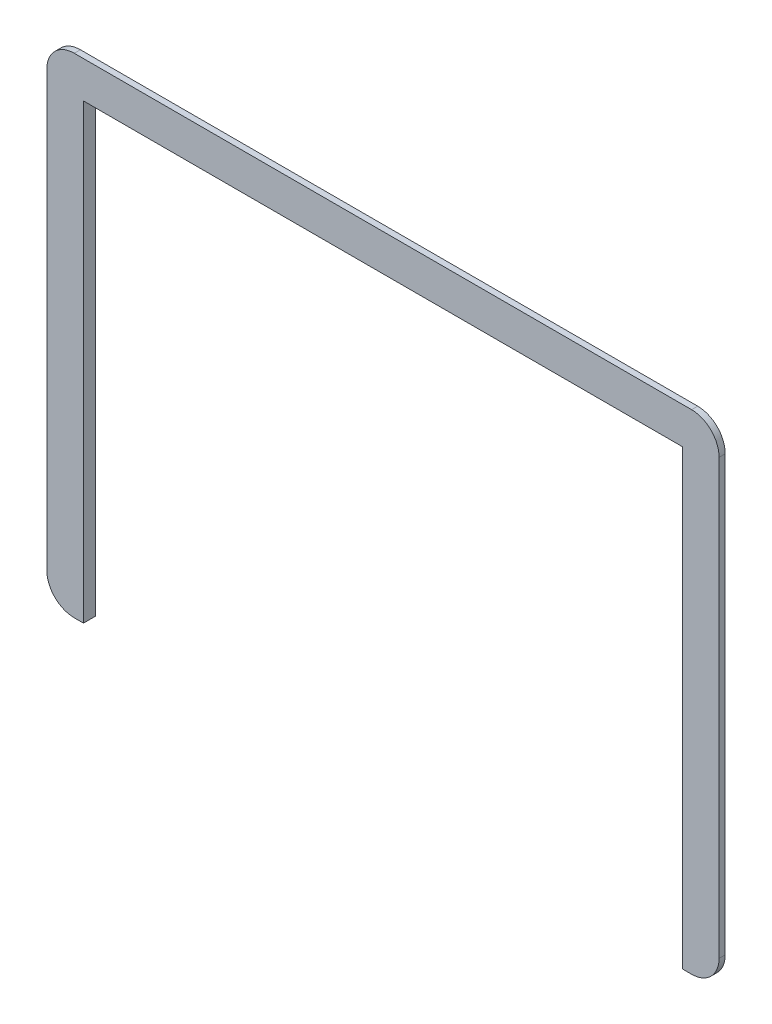
ISO-10303-21;
HEADER;
FILE_DESCRIPTION(('STEP AP214'),'2;1');
FILE_NAME('part.step','',(''),(''),'','','');
FILE_SCHEMA(('AUTOMOTIVE_DESIGN { 1 0 10303 214 1 1 1 1 }'));
ENDSEC;
DATA;
#1=APPLICATION_CONTEXT('core data for automotive mechanical design processes');
#2=APPLICATION_PROTOCOL_DEFINITION('international standard','automotive_design',2000,#1);
#3=PRODUCT_CONTEXT('',#1,'mechanical');
#4=PRODUCT('Part','Part','',(#3));
#5=PRODUCT_RELATED_PRODUCT_CATEGORY('part','',(#4));
#6=PRODUCT_DEFINITION_FORMATION('','',#4);
#7=PRODUCT_DEFINITION_CONTEXT('part definition',#1,'design');
#8=PRODUCT_DEFINITION('design','',#6,#7);
#9=PRODUCT_DEFINITION_SHAPE('','',#8);
#10=(LENGTH_UNIT() NAMED_UNIT(*) SI_UNIT(.MILLI.,.METRE.));
#11=(NAMED_UNIT(*) PLANE_ANGLE_UNIT() SI_UNIT($,.RADIAN.));
#12=(NAMED_UNIT(*) SI_UNIT($,.STERADIAN.) SOLID_ANGLE_UNIT());
#13=UNCERTAINTY_MEASURE_WITH_UNIT(LENGTH_MEASURE(1.E-05),#10,'distance_accuracy_value','');
#14=(GEOMETRIC_REPRESENTATION_CONTEXT(3) GLOBAL_UNCERTAINTY_ASSIGNED_CONTEXT((#13)) GLOBAL_UNIT_ASSIGNED_CONTEXT((#10,
#11,#12)) REPRESENTATION_CONTEXT('',''));
#15=CARTESIAN_POINT('',(0.,0.,0.));
#16=DIRECTION('',(0.,0.,1.));
#17=DIRECTION('',(1.,0.,0.));
#18=AXIS2_PLACEMENT_3D('',#15,#16,#17);
#19=CARTESIAN_POINT('',(-40.7055055401663,140.131578947368,2.));
#20=DIRECTION('',(1.,0.,0.));
#21=DIRECTION('',(0.,1.,0.));
#22=AXIS2_PLACEMENT_3D('',#19,#20,#21);
#23=PLANE('',#22);
#24=DIRECTION('',(0.,-1.,0.));
#25=VECTOR('',#24,1.);
#26=CARTESIAN_POINT('',(-40.7055055401663,140.131578947368,2.));
#27=LINE('',#26,#25);
#28=CARTESIAN_POINT('',(-40.7055055401663,131.131578947368,2.));
#29=VERTEX_POINT('',#28);
#30=CARTESIAN_POINT('',(-40.7055055401663,-10.8684210526316,2.));
#31=VERTEX_POINT('',#30);
#32=EDGE_CURVE('E217',#29,#31,#27,.T.);
#33=ORIENTED_EDGE('',*,*,#32,.F.);
#34=DIRECTION('',(0.,0.,-1.));
#35=VECTOR('',#34,1.);
#36=CARTESIAN_POINT('',(-40.7055055401663,131.131578947368,2.));
#37=LINE('',#36,#35);
#38=CARTESIAN_POINT('',(-40.7055055401663,131.131578947368,0.));
#39=VERTEX_POINT('',#38);
#40=EDGE_CURVE('E40',#29,#39,#37,.T.);
#41=ORIENTED_EDGE('',*,*,#40,.T.);
#42=DIRECTION('',(0.,-1.,0.));
#43=VECTOR('',#42,1.);
#44=CARTESIAN_POINT('',(-40.7055055401663,140.131578947368,0.));
#45=LINE('',#44,#43);
#46=CARTESIAN_POINT('',(-40.7055055401663,-10.8684210526316,0.));
#47=VERTEX_POINT('',#46);
#48=EDGE_CURVE('E202',#39,#47,#45,.T.);
#49=ORIENTED_EDGE('',*,*,#48,.T.);
#50=DIRECTION('',(0.,0.,-1.));
#51=VECTOR('',#50,1.);
#52=CARTESIAN_POINT('',(-40.7055055401663,-10.8684210526316,2.));
#53=LINE('',#52,#51);
#54=EDGE_CURVE('E274',#47,#31,#53,.F.);
#55=ORIENTED_EDGE('',*,*,#54,.T.);
#56=EDGE_LOOP('',(#33,#41,#49,#55));
#57=FACE_BOUND('',#56,.T.);
#58=ADVANCED_FACE('F32',(#57),#23,.F.);
#59=CARTESIAN_POINT('',(-40.7055055401663,-19.8684210526316,2.));
#60=DIRECTION('',(0.,1.,0.));
#61=DIRECTION('',(0.,0.,1.));
#62=AXIS2_PLACEMENT_3D('',#59,#60,#61);
#63=PLANE('',#62);
#64=DIRECTION('',(1.,0.,0.));
#65=VECTOR('',#64,1.);
#66=CARTESIAN_POINT('',(-40.7055055401663,-19.8684210526316,2.));
#67=LINE('',#66,#65);
#68=CARTESIAN_POINT('',(-31.7055055401662,-19.8684210526316,2.));
#69=VERTEX_POINT('',#68);
#70=CARTESIAN_POINT('',(-28.7055055401662,-19.8684210526316,2.));
#71=VERTEX_POINT('',#70);
#72=EDGE_CURVE('E220',#69,#71,#67,.T.);
#73=ORIENTED_EDGE('',*,*,#72,.F.);
#74=DIRECTION('',(0.,0.,-1.));
#75=VECTOR('',#74,1.);
#76=CARTESIAN_POINT('',(-31.7055055401662,-19.8684210526316,2.));
#77=LINE('',#76,#75);
#78=CARTESIAN_POINT('',(-31.7055055401662,-19.8684210526316,0.));
#79=VERTEX_POINT('',#78);
#80=EDGE_CURVE('E11',#69,#79,#77,.T.);
#81=ORIENTED_EDGE('',*,*,#80,.T.);
#82=DIRECTION('',(1.,0.,0.));
#83=VECTOR('',#82,1.);
#84=CARTESIAN_POINT('',(-40.7055055401663,-19.8684210526316,0.));
#85=LINE('',#84,#83);
#86=CARTESIAN_POINT('',(-30.7055055401662,-19.8684210526316,0.));
#87=VERTEX_POINT('',#86);
#88=EDGE_CURVE('E154',#79,#87,#85,.T.);
#89=ORIENTED_EDGE('',*,*,#88,.T.);
#90=DIRECTION('',(0.,0.,1.));
#91=VECTOR('',#90,1.);
#92=CARTESIAN_POINT('',(-30.7055055401662,-19.8684210526316,-2.));
#93=LINE('',#92,#91);
#94=CARTESIAN_POINT('',(-30.7055055401662,-19.8684210526316,-2.));
#95=VERTEX_POINT('',#94);
#96=EDGE_CURVE('E147',#95,#87,#93,.T.);
#97=ORIENTED_EDGE('',*,*,#96,.F.);
#98=DIRECTION('',(1.,0.,0.));
#99=VECTOR('',#98,1.);
#100=CARTESIAN_POINT('',(-30.7055055401662,-19.8684210526316,-2.));
#101=LINE('',#100,#99);
#102=CARTESIAN_POINT('',(-28.7055055401662,-19.8684210526316,-2.));
#103=VERTEX_POINT('',#102);
#104=EDGE_CURVE('E152',#95,#103,#101,.T.);
#105=ORIENTED_EDGE('',*,*,#104,.T.);
#106=DIRECTION('',(0.,0.,1.));
#107=VECTOR('',#106,1.);
#108=CARTESIAN_POINT('',(-28.7055055401662,-19.8684210526316,-2.));
#109=LINE('',#108,#107);
#110=EDGE_CURVE('E159',#103,#71,#109,.T.);
#111=ORIENTED_EDGE('',*,*,#110,.T.);
#112=EDGE_LOOP('',(#73,#81,#89,#97,#105,#111));
#113=FACE_BOUND('',#112,.T.);
#114=ADVANCED_FACE('F150',(#113),#63,.F.);
#115=CARTESIAN_POINT('',(169.294494459834,-19.8684210526316,2.));
#116=DIRECTION('',(0.,1.,0.));
#117=DIRECTION('',(0.,0.,1.));
#118=AXIS2_PLACEMENT_3D('',#115,#116,#117);
#119=PLANE('',#118);
#120=DIRECTION('',(1.,0.,0.));
#121=VECTOR('',#120,1.);
#122=CARTESIAN_POINT('',(169.294494459834,-19.8684210526316,0.));
#123=LINE('',#122,#121);
#124=CARTESIAN_POINT('',(169.294494459834,-19.8684210526316,0.));
#125=VERTEX_POINT('',#124);
#126=CARTESIAN_POINT('',(170.294494459834,-19.8684210526316,0.));
#127=VERTEX_POINT('',#126);
#128=EDGE_CURVE('E242',#125,#127,#123,.T.);
#129=ORIENTED_EDGE('',*,*,#128,.T.);
#130=DIRECTION('',(0.,0.,-1.));
#131=VECTOR('',#130,1.);
#132=CARTESIAN_POINT('',(170.294494459834,-19.8684210526316,2.));
#133=LINE('',#132,#131);
#134=CARTESIAN_POINT('',(170.294494459834,-19.8684210526316,2.));
#135=VERTEX_POINT('',#134);
#136=EDGE_CURVE('E261',#127,#135,#133,.F.);
#137=ORIENTED_EDGE('',*,*,#136,.T.);
#138=DIRECTION('',(1.,0.,0.));
#139=VECTOR('',#138,1.);
#140=CARTESIAN_POINT('',(169.294494459834,-19.8684210526316,2.));
#141=LINE('',#140,#139);
#142=CARTESIAN_POINT('',(167.294494459834,-19.8684210526316,2.));
#143=VERTEX_POINT('',#142);
#144=EDGE_CURVE('E223',#143,#135,#141,.T.);
#145=ORIENTED_EDGE('',*,*,#144,.F.);
#146=DIRECTION('',(0.,0.,1.));
#147=VECTOR('',#146,1.);
#148=CARTESIAN_POINT('',(167.294494459834,-19.8684210526316,-2.));
#149=LINE('',#148,#147);
#150=CARTESIAN_POINT('',(167.294494459834,-19.8684210526316,-2.));
#151=VERTEX_POINT('',#150);
#152=EDGE_CURVE('E209',#151,#143,#149,.T.);
#153=ORIENTED_EDGE('',*,*,#152,.F.);
#154=DIRECTION('',(1.,0.,0.));
#155=VECTOR('',#154,1.);
#156=CARTESIAN_POINT('',(167.294494459834,-19.8684210526316,-2.));
#157=LINE('',#156,#155);
#158=CARTESIAN_POINT('',(169.294494459834,-19.8684210526316,-2.));
#159=VERTEX_POINT('',#158);
#160=EDGE_CURVE('E189',#151,#159,#157,.T.);
#161=ORIENTED_EDGE('',*,*,#160,.T.);
#162=DIRECTION('',(0.,0.,1.));
#163=VECTOR('',#162,1.);
#164=CARTESIAN_POINT('',(169.294494459834,-19.8684210526316,-2.));
#165=LINE('',#164,#163);
#166=EDGE_CURVE('E206',#159,#125,#165,.T.);
#167=ORIENTED_EDGE('',*,*,#166,.T.);
#168=EDGE_LOOP('',(#129,#137,#145,#153,#161,#167));
#169=FACE_BOUND('',#168,.T.);
#170=ADVANCED_FACE('F307',(#169),#119,.F.);
#171=CARTESIAN_POINT('',(179.294494459834,-19.8684210526316,2.));
#172=DIRECTION('',(-1.,0.,0.));
#173=DIRECTION('',(0.,0.,1.));
#174=AXIS2_PLACEMENT_3D('',#171,#172,#173);
#175=PLANE('',#174);
#176=DIRECTION('',(0.,1.,0.));
#177=VECTOR('',#176,1.);
#178=CARTESIAN_POINT('',(179.294494459834,-19.8684210526316,2.));
#179=LINE('',#178,#177);
#180=CARTESIAN_POINT('',(179.294494459834,-10.8684210526316,2.));
#181=VERTEX_POINT('',#180);
#182=CARTESIAN_POINT('',(179.294494459834,131.131578947368,2.));
#183=VERTEX_POINT('',#182);
#184=EDGE_CURVE('E226',#181,#183,#179,.T.);
#185=ORIENTED_EDGE('',*,*,#184,.F.);
#186=DIRECTION('',(0.,0.,-1.));
#187=VECTOR('',#186,1.);
#188=CARTESIAN_POINT('',(179.294494459834,-10.8684210526316,2.));
#189=LINE('',#188,#187);
#190=CARTESIAN_POINT('',(179.294494459834,-10.8684210526316,0.));
#191=VERTEX_POINT('',#190);
#192=EDGE_CURVE('E250',#181,#191,#189,.T.);
#193=ORIENTED_EDGE('',*,*,#192,.T.);
#194=DIRECTION('',(0.,1.,0.));
#195=VECTOR('',#194,1.);
#196=CARTESIAN_POINT('',(179.294494459834,-19.8684210526316,0.));
#197=LINE('',#196,#195);
#198=CARTESIAN_POINT('',(179.294494459834,131.131578947368,0.));
#199=VERTEX_POINT('',#198);
#200=EDGE_CURVE('E245',#191,#199,#197,.T.);
#201=ORIENTED_EDGE('',*,*,#200,.T.);
#202=DIRECTION('',(0.,0.,-1.));
#203=VECTOR('',#202,1.);
#204=CARTESIAN_POINT('',(179.294494459834,131.131578947368,2.));
#205=LINE('',#204,#203);
#206=EDGE_CURVE('E230',#199,#183,#205,.F.);
#207=ORIENTED_EDGE('',*,*,#206,.T.);
#208=EDGE_LOOP('',(#185,#193,#201,#207));
#209=FACE_BOUND('',#208,.T.);
#210=ADVANCED_FACE('F323',(#209),#175,.F.);
#211=CARTESIAN_POINT('',(179.294494459834,140.131578947368,2.));
#212=DIRECTION('',(0.,-1.,0.));
#213=DIRECTION('',(1.,0.,0.));
#214=AXIS2_PLACEMENT_3D('',#211,#212,#213);
#215=PLANE('',#214);
#216=DIRECTION('',(-1.,0.,0.));
#217=VECTOR('',#216,1.);
#218=CARTESIAN_POINT('',(179.294494459834,140.131578947368,2.));
#219=LINE('',#218,#217);
#220=CARTESIAN_POINT('',(170.294494459834,140.131578947368,2.));
#221=VERTEX_POINT('',#220);
#222=CARTESIAN_POINT('',(-31.7055055401663,140.131578947368,2.));
#223=VERTEX_POINT('',#222);
#224=EDGE_CURVE('E228',#221,#223,#219,.T.);
#225=ORIENTED_EDGE('',*,*,#224,.F.);
#226=DIRECTION('',(0.,0.,-1.));
#227=VECTOR('',#226,1.);
#228=CARTESIAN_POINT('',(170.294494459834,140.131578947368,2.));
#229=LINE('',#228,#227);
#230=CARTESIAN_POINT('',(170.294494459834,140.131578947368,0.));
#231=VERTEX_POINT('',#230);
#232=EDGE_CURVE('E271',#221,#231,#229,.T.);
#233=ORIENTED_EDGE('',*,*,#232,.T.);
#234=DIRECTION('',(-1.,0.,0.));
#235=VECTOR('',#234,1.);
#236=CARTESIAN_POINT('',(179.294494459834,140.131578947368,0.));
#237=LINE('',#236,#235);
#238=CARTESIAN_POINT('',(-31.7055055401663,140.131578947368,0.));
#239=VERTEX_POINT('',#238);
#240=EDGE_CURVE('E221',#231,#239,#237,.T.);
#241=ORIENTED_EDGE('',*,*,#240,.T.);
#242=DIRECTION('',(0.,0.,-1.));
#243=VECTOR('',#242,1.);
#244=CARTESIAN_POINT('',(-31.7055055401663,140.131578947368,2.));
#245=LINE('',#244,#243);
#246=EDGE_CURVE('E47',#239,#223,#245,.F.);
#247=ORIENTED_EDGE('',*,*,#246,.T.);
#248=EDGE_LOOP('',(#225,#233,#241,#247));
#249=FACE_BOUND('',#248,.T.);
#250=ADVANCED_FACE('F326',(#249),#215,.F.);
#251=CARTESIAN_POINT('',(0.,0.,2.));
#252=DIRECTION('',(0.,0.,1.));
#253=DIRECTION('',(1.,0.,0.));
#254=AXIS2_PLACEMENT_3D('',#251,#252,#253);
#255=PLANE('',#254);
#256=ORIENTED_EDGE('',*,*,#144,.T.);
#257=CARTESIAN_POINT('',(170.294494459834,-10.8684210526316,2.));
#258=DIRECTION('',(0.,0.,1.));
#259=DIRECTION('',(1.,0.,0.));
#260=AXIS2_PLACEMENT_3D('',#257,#258,#259);
#261=CIRCLE('',#260,9.);
#262=EDGE_CURVE('E268',#135,#181,#261,.T.);
#263=ORIENTED_EDGE('',*,*,#262,.T.);
#264=ORIENTED_EDGE('',*,*,#184,.T.);
#265=CARTESIAN_POINT('',(170.294494459834,131.131578947368,2.));
#266=DIRECTION('',(0.,0.,1.));
#267=DIRECTION('',(1.,0.,0.));
#268=AXIS2_PLACEMENT_3D('',#265,#266,#267);
#269=CIRCLE('',#268,9.);
#270=EDGE_CURVE('E54',#183,#221,#269,.T.);
#271=ORIENTED_EDGE('',*,*,#270,.T.);
#272=ORIENTED_EDGE('',*,*,#224,.T.);
#273=CARTESIAN_POINT('',(-31.7055055401663,131.131578947368,2.));
#274=DIRECTION('',(0.,0.,1.));
#275=DIRECTION('',(1.,0.,0.));
#276=AXIS2_PLACEMENT_3D('',#273,#274,#275);
#277=CIRCLE('',#276,9.);
#278=EDGE_CURVE('E265',#223,#29,#277,.T.);
#279=ORIENTED_EDGE('',*,*,#278,.T.);
#280=ORIENTED_EDGE('',*,*,#32,.T.);
#281=CARTESIAN_POINT('',(-31.7055055401662,-10.8684210526316,2.));
#282=DIRECTION('',(0.,0.,1.));
#283=DIRECTION('',(1.,0.,0.));
#284=AXIS2_PLACEMENT_3D('',#281,#282,#283);
#285=CIRCLE('',#284,9.);
#286=EDGE_CURVE('E263',#31,#69,#285,.T.);
#287=ORIENTED_EDGE('',*,*,#286,.T.);
#288=ORIENTED_EDGE('',*,*,#72,.T.);
#289=DIRECTION('',(0.,1.,0.));
#290=VECTOR('',#289,1.);
#291=CARTESIAN_POINT('',(-28.7055055401662,-19.8684210526316,2.));
#292=LINE('',#291,#290);
#293=CARTESIAN_POINT('',(-28.7055055401662,128.131578947368,2.));
#294=VERTEX_POINT('',#293);
#295=EDGE_CURVE('E196',#71,#294,#292,.T.);
#296=ORIENTED_EDGE('',*,*,#295,.T.);
#297=DIRECTION('',(1.,0.,0.));
#298=VECTOR('',#297,1.);
#299=CARTESIAN_POINT('',(-28.7055055401662,128.131578947368,2.));
#300=LINE('',#299,#298);
#301=CARTESIAN_POINT('',(167.294494459834,128.131578947368,2.));
#302=VERTEX_POINT('',#301);
#303=EDGE_CURVE('E179',#294,#302,#300,.T.);
#304=ORIENTED_EDGE('',*,*,#303,.T.);
#305=DIRECTION('',(0.,-1.,0.));
#306=VECTOR('',#305,1.);
#307=CARTESIAN_POINT('',(167.294494459834,128.131578947368,2.));
#308=LINE('',#307,#306);
#309=EDGE_CURVE('E176',#302,#143,#308,.T.);
#310=ORIENTED_EDGE('',*,*,#309,.T.);
#311=EDGE_LOOP('',(#256,#263,#264,#271,#272,#279,#280,#287,#288,#296,#304,#310));
#312=FACE_BOUND('',#311,.T.);
#313=ADVANCED_FACE('F291',(#312),#255,.T.);
#314=CARTESIAN_POINT('',(0.,0.,0.));
#315=DIRECTION('',(0.,0.,1.));
#316=DIRECTION('',(1.,0.,0.));
#317=AXIS2_PLACEMENT_3D('',#314,#315,#316);
#318=PLANE('',#317);
#319=ORIENTED_EDGE('',*,*,#200,.F.);
#320=CARTESIAN_POINT('',(170.294494459834,-10.8684210526316,0.));
#321=DIRECTION('',(0.,0.,1.));
#322=DIRECTION('',(1.,0.,0.));
#323=AXIS2_PLACEMENT_3D('',#320,#321,#322);
#324=CIRCLE('',#323,9.);
#325=EDGE_CURVE('E259',#191,#127,#324,.F.);
#326=ORIENTED_EDGE('',*,*,#325,.T.);
#327=ORIENTED_EDGE('',*,*,#128,.F.);
#328=DIRECTION('',(0.,-1.,0.));
#329=VECTOR('',#328,1.);
#330=CARTESIAN_POINT('',(169.294494459834,130.131578947368,0.));
#331=LINE('',#330,#329);
#332=CARTESIAN_POINT('',(169.294494459834,130.131578947368,0.));
#333=VERTEX_POINT('',#332);
#334=EDGE_CURVE('E239',#333,#125,#331,.T.);
#335=ORIENTED_EDGE('',*,*,#334,.F.);
#336=DIRECTION('',(1.,0.,0.));
#337=VECTOR('',#336,1.);
#338=CARTESIAN_POINT('',(-30.7055055401662,130.131578947368,0.));
#339=LINE('',#338,#337);
#340=CARTESIAN_POINT('',(-30.7055055401662,130.131578947368,0.));
#341=VERTEX_POINT('',#340);
#342=EDGE_CURVE('E236',#341,#333,#339,.T.);
#343=ORIENTED_EDGE('',*,*,#342,.F.);
#344=DIRECTION('',(0.,1.,0.));
#345=VECTOR('',#344,1.);
#346=CARTESIAN_POINT('',(-30.7055055401662,-19.8684210526316,0.));
#347=LINE('',#346,#345);
#348=EDGE_CURVE('E234',#87,#341,#347,.T.);
#349=ORIENTED_EDGE('',*,*,#348,.F.);
#350=ORIENTED_EDGE('',*,*,#88,.F.);
#351=CARTESIAN_POINT('',(-31.7055055401662,-10.8684210526316,0.));
#352=DIRECTION('',(0.,0.,1.));
#353=DIRECTION('',(1.,0.,0.));
#354=AXIS2_PLACEMENT_3D('',#351,#352,#353);
#355=CIRCLE('',#354,9.);
#356=EDGE_CURVE('E253',#79,#47,#355,.F.);
#357=ORIENTED_EDGE('',*,*,#356,.T.);
#358=ORIENTED_EDGE('',*,*,#48,.F.);
#359=CARTESIAN_POINT('',(-31.7055055401663,131.131578947368,0.));
#360=DIRECTION('',(0.,0.,1.));
#361=DIRECTION('',(1.,0.,0.));
#362=AXIS2_PLACEMENT_3D('',#359,#360,#361);
#363=CIRCLE('',#362,9.);
#364=EDGE_CURVE('E255',#39,#239,#363,.F.);
#365=ORIENTED_EDGE('',*,*,#364,.T.);
#366=ORIENTED_EDGE('',*,*,#240,.F.);
#367=CARTESIAN_POINT('',(170.294494459834,131.131578947368,0.));
#368=DIRECTION('',(0.,0.,1.));
#369=DIRECTION('',(1.,0.,0.));
#370=AXIS2_PLACEMENT_3D('',#367,#368,#369);
#371=CIRCLE('',#370,9.);
#372=EDGE_CURVE('E257',#231,#199,#371,.F.);
#373=ORIENTED_EDGE('',*,*,#372,.T.);
#374=EDGE_LOOP('',(#319,#326,#327,#335,#343,#349,#350,#357,#358,#365,#366,#373));
#375=FACE_BOUND('',#374,.T.);
#376=ADVANCED_FACE('F285',(#375),#318,.F.);
#377=CARTESIAN_POINT('',(-30.7055055401662,130.131578947368,-2.));
#378=DIRECTION('',(-1.,0.,0.));
#379=DIRECTION('',(0.,0.,1.));
#380=AXIS2_PLACEMENT_3D('',#377,#378,#379);
#381=PLANE('',#380);
#382=ORIENTED_EDGE('',*,*,#348,.T.);
#383=DIRECTION('',(0.,0.,1.));
#384=VECTOR('',#383,1.);
#385=CARTESIAN_POINT('',(-30.7055055401662,130.131578947368,-2.));
#386=LINE('',#385,#384);
#387=CARTESIAN_POINT('',(-30.7055055401662,130.131578947368,-2.));
#388=VERTEX_POINT('',#387);
#389=EDGE_CURVE('E175',#388,#341,#386,.T.);
#390=ORIENTED_EDGE('',*,*,#389,.F.);
#391=DIRECTION('',(0.,-1.,0.));
#392=VECTOR('',#391,1.);
#393=CARTESIAN_POINT('',(-30.7055055401662,130.131578947368,-2.));
#394=LINE('',#393,#392);
#395=EDGE_CURVE('E167',#388,#95,#394,.T.);
#396=ORIENTED_EDGE('',*,*,#395,.T.);
#397=ORIENTED_EDGE('',*,*,#96,.T.);
#398=EDGE_LOOP('',(#382,#390,#396,#397));
#399=FACE_BOUND('',#398,.T.);
#400=ADVANCED_FACE('F173',(#399),#381,.T.);
#401=CARTESIAN_POINT('',(169.294494459834,130.131578947368,-2.));
#402=DIRECTION('',(0.,1.,0.));
#403=DIRECTION('',(0.,0.,1.));
#404=AXIS2_PLACEMENT_3D('',#401,#402,#403);
#405=PLANE('',#404);
#406=ORIENTED_EDGE('',*,*,#342,.T.);
#407=DIRECTION('',(0.,0.,1.));
#408=VECTOR('',#407,1.);
#409=CARTESIAN_POINT('',(169.294494459834,130.131578947368,-2.));
#410=LINE('',#409,#408);
#411=CARTESIAN_POINT('',(169.294494459834,130.131578947368,-2.));
#412=VERTEX_POINT('',#411);
#413=EDGE_CURVE('E203',#412,#333,#410,.T.);
#414=ORIENTED_EDGE('',*,*,#413,.F.);
#415=DIRECTION('',(-1.,0.,0.));
#416=VECTOR('',#415,1.);
#417=CARTESIAN_POINT('',(169.294494459834,130.131578947368,-2.));
#418=LINE('',#417,#416);
#419=EDGE_CURVE('E160',#412,#388,#418,.T.);
#420=ORIENTED_EDGE('',*,*,#419,.T.);
#421=ORIENTED_EDGE('',*,*,#389,.T.);
#422=EDGE_LOOP('',(#406,#414,#420,#421));
#423=FACE_BOUND('',#422,.T.);
#424=ADVANCED_FACE('F334',(#423),#405,.T.);
#425=CARTESIAN_POINT('',(169.294494459834,-19.8684210526316,-2.));
#426=DIRECTION('',(1.,0.,0.));
#427=DIRECTION('',(0.,0.,-1.));
#428=AXIS2_PLACEMENT_3D('',#425,#426,#427);
#429=PLANE('',#428);
#430=ORIENTED_EDGE('',*,*,#334,.T.);
#431=ORIENTED_EDGE('',*,*,#166,.F.);
#432=DIRECTION('',(0.,1.,0.));
#433=VECTOR('',#432,1.);
#434=CARTESIAN_POINT('',(169.294494459834,-19.8684210526316,-2.));
#435=LINE('',#434,#433);
#436=EDGE_CURVE('E192',#159,#412,#435,.T.);
#437=ORIENTED_EDGE('',*,*,#436,.T.);
#438=ORIENTED_EDGE('',*,*,#413,.T.);
#439=EDGE_LOOP('',(#430,#431,#437,#438));
#440=FACE_BOUND('',#439,.T.);
#441=ADVANCED_FACE('F331',(#440),#429,.T.);
#442=CARTESIAN_POINT('',(167.294494459834,128.131578947368,-2.));
#443=DIRECTION('',(-1.,0.,0.));
#444=DIRECTION('',(0.,-1.,0.));
#445=AXIS2_PLACEMENT_3D('',#442,#443,#444);
#446=PLANE('',#445);
#447=ORIENTED_EDGE('',*,*,#309,.F.);
#448=DIRECTION('',(0.,0.,1.));
#449=VECTOR('',#448,1.);
#450=CARTESIAN_POINT('',(167.294494459834,128.131578947368,-2.));
#451=LINE('',#450,#449);
#452=CARTESIAN_POINT('',(167.294494459834,128.131578947368,-2.));
#453=VERTEX_POINT('',#452);
#454=EDGE_CURVE('E212',#453,#302,#451,.T.);
#455=ORIENTED_EDGE('',*,*,#454,.F.);
#456=DIRECTION('',(0.,-1.,0.));
#457=VECTOR('',#456,1.);
#458=CARTESIAN_POINT('',(167.294494459834,128.131578947368,-2.));
#459=LINE('',#458,#457);
#460=EDGE_CURVE('E186',#453,#151,#459,.T.);
#461=ORIENTED_EDGE('',*,*,#460,.T.);
#462=ORIENTED_EDGE('',*,*,#152,.T.);
#463=EDGE_LOOP('',(#447,#455,#461,#462));
#464=FACE_BOUND('',#463,.T.);
#465=ADVANCED_FACE('F341',(#464),#446,.T.);
#466=CARTESIAN_POINT('',(-28.7055055401662,128.131578947368,-2.));
#467=DIRECTION('',(0.,-1.,0.));
#468=DIRECTION('',(0.,0.,-1.));
#469=AXIS2_PLACEMENT_3D('',#466,#467,#468);
#470=PLANE('',#469);
#471=ORIENTED_EDGE('',*,*,#303,.F.);
#472=DIRECTION('',(0.,0.,1.));
#473=VECTOR('',#472,1.);
#474=CARTESIAN_POINT('',(-28.7055055401662,128.131578947368,-2.));
#475=LINE('',#474,#473);
#476=CARTESIAN_POINT('',(-28.7055055401662,128.131578947368,-2.));
#477=VERTEX_POINT('',#476);
#478=EDGE_CURVE('E214',#477,#294,#475,.T.);
#479=ORIENTED_EDGE('',*,*,#478,.F.);
#480=DIRECTION('',(1.,0.,0.));
#481=VECTOR('',#480,1.);
#482=CARTESIAN_POINT('',(-28.7055055401662,128.131578947368,-2.));
#483=LINE('',#482,#481);
#484=EDGE_CURVE('E183',#477,#453,#483,.T.);
#485=ORIENTED_EDGE('',*,*,#484,.T.);
#486=ORIENTED_EDGE('',*,*,#454,.T.);
#487=EDGE_LOOP('',(#471,#479,#485,#486));
#488=FACE_BOUND('',#487,.T.);
#489=ADVANCED_FACE('F347',(#488),#470,.T.);
#490=CARTESIAN_POINT('',(-28.7055055401662,-19.8684210526316,-2.));
#491=DIRECTION('',(1.,0.,0.));
#492=DIRECTION('',(0.,0.,-1.));
#493=AXIS2_PLACEMENT_3D('',#490,#491,#492);
#494=PLANE('',#493);
#495=ORIENTED_EDGE('',*,*,#295,.F.);
#496=ORIENTED_EDGE('',*,*,#110,.F.);
#497=DIRECTION('',(0.,1.,0.));
#498=VECTOR('',#497,1.);
#499=CARTESIAN_POINT('',(-28.7055055401662,-19.8684210526316,-2.));
#500=LINE('',#499,#498);
#501=EDGE_CURVE('E171',#103,#477,#500,.T.);
#502=ORIENTED_EDGE('',*,*,#501,.T.);
#503=ORIENTED_EDGE('',*,*,#478,.T.);
#504=EDGE_LOOP('',(#495,#496,#502,#503));
#505=FACE_BOUND('',#504,.T.);
#506=ADVANCED_FACE('F316',(#505),#494,.T.);
#507=CARTESIAN_POINT('',(0.,0.,-2.));
#508=DIRECTION('',(0.,0.,1.));
#509=DIRECTION('',(1.,0.,0.));
#510=AXIS2_PLACEMENT_3D('',#507,#508,#509);
#511=PLANE('',#510);
#512=ORIENTED_EDGE('',*,*,#395,.F.);
#513=ORIENTED_EDGE('',*,*,#419,.F.);
#514=ORIENTED_EDGE('',*,*,#436,.F.);
#515=ORIENTED_EDGE('',*,*,#160,.F.);
#516=ORIENTED_EDGE('',*,*,#460,.F.);
#517=ORIENTED_EDGE('',*,*,#484,.F.);
#518=ORIENTED_EDGE('',*,*,#501,.F.);
#519=ORIENTED_EDGE('',*,*,#104,.F.);
#520=EDGE_LOOP('',(#512,#513,#514,#515,#516,#517,#518,#519));
#521=FACE_BOUND('',#520,.T.);
#522=ADVANCED_FACE('F165',(#521),#511,.F.);
#523=CARTESIAN_POINT('',(170.294494459834,-10.8684210526316,2.));
#524=DIRECTION('',(0.,0.,-1.));
#525=DIRECTION('',(-1.,0.,0.));
#526=AXIS2_PLACEMENT_3D('',#523,#524,#525);
#527=CYLINDRICAL_SURFACE('',#526,9.);
#528=ORIENTED_EDGE('',*,*,#262,.F.);
#529=ORIENTED_EDGE('',*,*,#136,.F.);
#530=ORIENTED_EDGE('',*,*,#325,.F.);
#531=ORIENTED_EDGE('',*,*,#192,.F.);
#532=EDGE_LOOP('',(#528,#529,#530,#531));
#533=FACE_BOUND('',#532,.T.);
#534=ADVANCED_FACE('F299',(#533),#527,.T.);
#535=CARTESIAN_POINT('',(170.294494459834,131.131578947368,2.));
#536=DIRECTION('',(0.,0.,-1.));
#537=DIRECTION('',(-1.,0.,0.));
#538=AXIS2_PLACEMENT_3D('',#535,#536,#537);
#539=CYLINDRICAL_SURFACE('',#538,9.);
#540=ORIENTED_EDGE('',*,*,#270,.F.);
#541=ORIENTED_EDGE('',*,*,#206,.F.);
#542=ORIENTED_EDGE('',*,*,#372,.F.);
#543=ORIENTED_EDGE('',*,*,#232,.F.);
#544=EDGE_LOOP('',(#540,#541,#542,#543));
#545=FACE_BOUND('',#544,.T.);
#546=ADVANCED_FACE('F294',(#545),#539,.T.);
#547=CARTESIAN_POINT('',(-31.7055055401663,131.131578947368,2.));
#548=DIRECTION('',(0.,0.,-1.));
#549=DIRECTION('',(-1.,0.,0.));
#550=AXIS2_PLACEMENT_3D('',#547,#548,#549);
#551=CYLINDRICAL_SURFACE('',#550,9.);
#552=ORIENTED_EDGE('',*,*,#278,.F.);
#553=ORIENTED_EDGE('',*,*,#246,.F.);
#554=ORIENTED_EDGE('',*,*,#364,.F.);
#555=ORIENTED_EDGE('',*,*,#40,.F.);
#556=EDGE_LOOP('',(#552,#553,#554,#555));
#557=FACE_BOUND('',#556,.T.);
#558=ADVANCED_FACE('F292',(#557),#551,.T.);
#559=CARTESIAN_POINT('',(-31.7055055401662,-10.8684210526316,2.));
#560=DIRECTION('',(0.,0.,-1.));
#561=DIRECTION('',(-1.,0.,0.));
#562=AXIS2_PLACEMENT_3D('',#559,#560,#561);
#563=CYLINDRICAL_SURFACE('',#562,9.);
#564=ORIENTED_EDGE('',*,*,#286,.F.);
#565=ORIENTED_EDGE('',*,*,#54,.F.);
#566=ORIENTED_EDGE('',*,*,#356,.F.);
#567=ORIENTED_EDGE('',*,*,#80,.F.);
#568=EDGE_LOOP('',(#564,#565,#566,#567));
#569=FACE_BOUND('',#568,.T.);
#570=ADVANCED_FACE('F34',(#569),#563,.T.);
#571=CLOSED_SHELL('',(#58,#114,#170,#210,#250,#313,#376,#400,#424,#441,#465,#489,#506,#522,#534,
#546,#558,#570));
#572=MANIFOLD_SOLID_BREP('B2',#571);
#573=ADVANCED_BREP_SHAPE_REPRESENTATION('',(#18,#572),#14);
#574=SHAPE_DEFINITION_REPRESENTATION(#9,#573);
ENDSEC;
END-ISO-10303-21;
